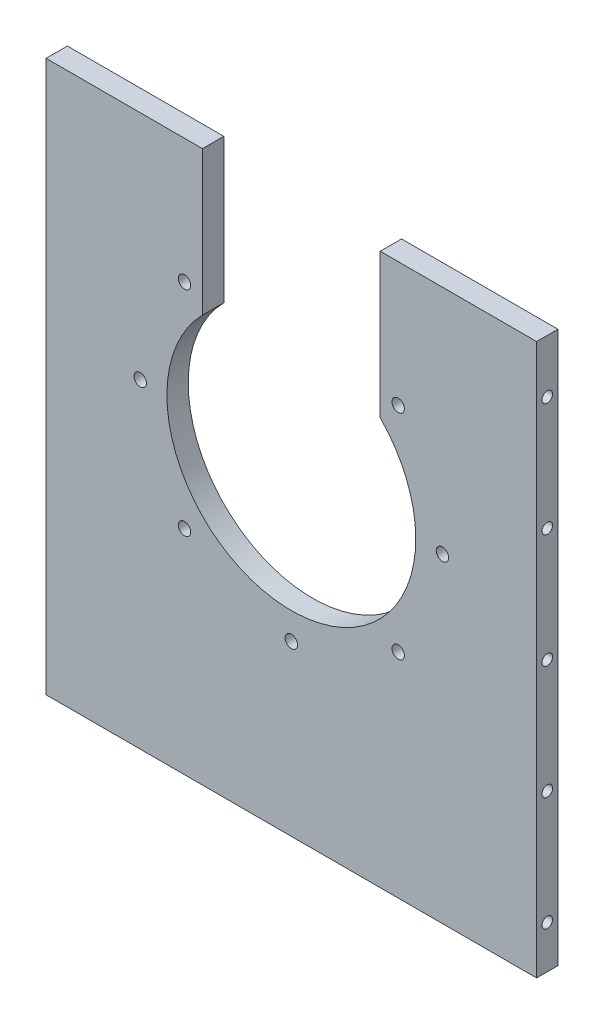
ISO-10303-21;
HEADER;
FILE_DESCRIPTION(('STEP AP214'),'2;1');
FILE_NAME('part.step','',(''),(''),'','','');
FILE_SCHEMA(('AUTOMOTIVE_DESIGN { 1 0 10303 214 1 1 1 1 }'));
ENDSEC;
DATA;
#1=APPLICATION_CONTEXT('core data for automotive mechanical design processes');
#2=APPLICATION_PROTOCOL_DEFINITION('international standard','automotive_design',2000,#1);
#3=PRODUCT_CONTEXT('',#1,'mechanical');
#4=PRODUCT('Part','Part','',(#3));
#5=PRODUCT_RELATED_PRODUCT_CATEGORY('part','',(#4));
#6=PRODUCT_DEFINITION_FORMATION('','',#4);
#7=PRODUCT_DEFINITION_CONTEXT('part definition',#1,'design');
#8=PRODUCT_DEFINITION('design','',#6,#7);
#9=PRODUCT_DEFINITION_SHAPE('','',#8);
#10=(LENGTH_UNIT() NAMED_UNIT(*) SI_UNIT(.MILLI.,.METRE.));
#11=(NAMED_UNIT(*) PLANE_ANGLE_UNIT() SI_UNIT($,.RADIAN.));
#12=(NAMED_UNIT(*) SI_UNIT($,.STERADIAN.) SOLID_ANGLE_UNIT());
#13=UNCERTAINTY_MEASURE_WITH_UNIT(LENGTH_MEASURE(1.E-05),#10,'distance_accuracy_value','');
#14=(GEOMETRIC_REPRESENTATION_CONTEXT(3) GLOBAL_UNCERTAINTY_ASSIGNED_CONTEXT((#13)) GLOBAL_UNIT_ASSIGNED_CONTEXT((#10,
#11,#12)) REPRESENTATION_CONTEXT('',''));
#15=CARTESIAN_POINT('',(0.,0.,0.));
#16=DIRECTION('',(0.,0.,1.));
#17=DIRECTION('',(1.,0.,0.));
#18=AXIS2_PLACEMENT_3D('',#15,#16,#17);
#19=CARTESIAN_POINT('',(0.,0.,6.));
#20=DIRECTION('',(0.,0.,1.));
#21=DIRECTION('',(1.,0.,0.));
#22=AXIS2_PLACEMENT_3D('',#19,#20,#21);
#23=PLANE('',#22);
#24=DIRECTION('',(1.,0.,0.));
#25=VECTOR('',#24,1.);
#26=CARTESIAN_POINT('',(0.,65.0520382004283,6.));
#27=LINE('',#26,#25);
#28=CARTESIAN_POINT('',(-69.,65.0520382004283,6.));
#29=VERTEX_POINT('',#28);
#30=CARTESIAN_POINT('',(-25.,65.0520382004283,6.));
#31=VERTEX_POINT('',#30);
#32=EDGE_CURVE('E62',#29,#31,#27,.T.);
#33=ORIENTED_EDGE('',*,*,#32,.F.);
#34=DIRECTION('',(0.,-1.,0.));
#35=VECTOR('',#34,1.);
#36=CARTESIAN_POINT('',(-69.,90.,6.));
#37=LINE('',#36,#35);
#38=CARTESIAN_POINT('',(-69.,-90.,6.));
#39=VERTEX_POINT('',#38);
#40=EDGE_CURVE('E130',#29,#39,#37,.T.);
#41=ORIENTED_EDGE('',*,*,#40,.T.);
#42=DIRECTION('',(1.,0.,0.));
#43=VECTOR('',#42,1.);
#44=CARTESIAN_POINT('',(-69.,-90.,6.));
#45=LINE('',#44,#43);
#46=CARTESIAN_POINT('',(69.,-90.,6.));
#47=VERTEX_POINT('',#46);
#48=EDGE_CURVE('E135',#39,#47,#45,.T.);
#49=ORIENTED_EDGE('',*,*,#48,.T.);
#50=DIRECTION('',(0.,1.,0.));
#51=VECTOR('',#50,1.);
#52=CARTESIAN_POINT('',(69.,90.,6.));
#53=LINE('',#52,#51);
#54=CARTESIAN_POINT('',(69.,65.0520382004283,6.));
#55=VERTEX_POINT('',#54);
#56=EDGE_CURVE('E144',#47,#55,#53,.T.);
#57=ORIENTED_EDGE('',*,*,#56,.T.);
#58=CARTESIAN_POINT('',(25.,65.0520382004283,6.));
#59=VERTEX_POINT('',#58);
#60=EDGE_CURVE('E105',#59,#55,#27,.T.);
#61=ORIENTED_EDGE('',*,*,#60,.F.);
#62=DIRECTION('',(0.,1.,0.));
#63=VECTOR('',#62,1.);
#64=CARTESIAN_POINT('',(25.,0.,6.));
#65=LINE('',#64,#63);
#66=CARTESIAN_POINT('',(25.,24.4948974278318,6.));
#67=VERTEX_POINT('',#66);
#68=EDGE_CURVE('E157',#67,#59,#65,.T.);
#69=ORIENTED_EDGE('',*,*,#68,.F.);
#70=CARTESIAN_POINT('',(0.,0.,6.));
#71=DIRECTION('',(0.,0.,1.));
#72=DIRECTION('',(1.,0.,0.));
#73=AXIS2_PLACEMENT_3D('',#70,#71,#72);
#74=CIRCLE('',#73,35.);
#75=CARTESIAN_POINT('',(-25.,24.4948974278318,6.));
#76=VERTEX_POINT('',#75);
#77=EDGE_CURVE('E165',#76,#67,#74,.T.);
#78=ORIENTED_EDGE('',*,*,#77,.F.);
#79=DIRECTION('',(0.,1.,0.));
#80=VECTOR('',#79,1.);
#81=CARTESIAN_POINT('',(-25.,0.,6.));
#82=LINE('',#81,#80);
#83=EDGE_CURVE('E168',#76,#31,#82,.T.);
#84=ORIENTED_EDGE('',*,*,#83,.T.);
#85=EDGE_LOOP('',(#33,#41,#49,#57,#61,#69,#78,#84));
#86=FACE_BOUND('',#85,.T.);
#87=CARTESIAN_POINT('',(-42.5,0.,6.));
#88=DIRECTION('',(0.,0.,1.));
#89=DIRECTION('',(1.,0.,0.));
#90=AXIS2_PLACEMENT_3D('',#87,#88,#89);
#91=CIRCLE('',#90,1.75);
#92=CARTESIAN_POINT('',(-40.75,0.,6.));
#93=VERTEX_POINT('',#92);
#94=EDGE_CURVE('E219',#93,#93,#91,.T.);
#95=ORIENTED_EDGE('',*,*,#94,.F.);
#96=EDGE_LOOP('',(#95));
#97=FACE_BOUND('',#96,.T.);
#98=CARTESIAN_POINT('',(0.,-42.5,6.));
#99=DIRECTION('',(0.,0.,1.));
#100=DIRECTION('',(1.,0.,0.));
#101=AXIS2_PLACEMENT_3D('',#98,#99,#100);
#102=CIRCLE('',#101,1.75);
#103=CARTESIAN_POINT('',(1.74999999999999,-42.5,6.));
#104=VERTEX_POINT('',#103);
#105=EDGE_CURVE('E235',#104,#104,#102,.T.);
#106=ORIENTED_EDGE('',*,*,#105,.F.);
#107=EDGE_LOOP('',(#106));
#108=FACE_BOUND('',#107,.T.);
#109=CARTESIAN_POINT('',(42.5,0.,6.));
#110=DIRECTION('',(0.,0.,1.));
#111=DIRECTION('',(1.,0.,0.));
#112=AXIS2_PLACEMENT_3D('',#109,#110,#111);
#113=CIRCLE('',#112,1.75);
#114=CARTESIAN_POINT('',(44.25,0.,6.));
#115=VERTEX_POINT('',#114);
#116=EDGE_CURVE('E251',#115,#115,#113,.T.);
#117=ORIENTED_EDGE('',*,*,#116,.F.);
#118=EDGE_LOOP('',(#117));
#119=FACE_BOUND('',#118,.T.);
#120=CARTESIAN_POINT('',(30.0520382004283,30.0520382004283,6.));
#121=DIRECTION('',(0.,0.,1.));
#122=DIRECTION('',(1.,0.,0.));
#123=AXIS2_PLACEMENT_3D('',#120,#121,#122);
#124=CIRCLE('',#123,1.75);
#125=CARTESIAN_POINT('',(31.8020382004283,30.0520382004283,6.));
#126=VERTEX_POINT('',#125);
#127=EDGE_CURVE('E177',#126,#126,#124,.T.);
#128=ORIENTED_EDGE('',*,*,#127,.F.);
#129=EDGE_LOOP('',(#128));
#130=FACE_BOUND('',#129,.T.);
#131=CARTESIAN_POINT('',(30.0520382004283,-30.0520382004283,6.));
#132=DIRECTION('',(0.,0.,1.));
#133=DIRECTION('',(1.,0.,0.));
#134=AXIS2_PLACEMENT_3D('',#131,#132,#133);
#135=CIRCLE('',#134,1.75);
#136=CARTESIAN_POINT('',(31.8020382004283,-30.0520382004283,6.));
#137=VERTEX_POINT('',#136);
#138=EDGE_CURVE('E243',#137,#137,#135,.T.);
#139=ORIENTED_EDGE('',*,*,#138,.F.);
#140=EDGE_LOOP('',(#139));
#141=FACE_BOUND('',#140,.T.);
#142=CARTESIAN_POINT('',(-30.0520382004283,-30.0520382004283,6.));
#143=DIRECTION('',(0.,0.,1.));
#144=DIRECTION('',(1.,0.,0.));
#145=AXIS2_PLACEMENT_3D('',#142,#143,#144);
#146=CIRCLE('',#145,1.75);
#147=CARTESIAN_POINT('',(-28.3020382004283,-30.0520382004283,6.));
#148=VERTEX_POINT('',#147);
#149=EDGE_CURVE('E227',#148,#148,#146,.T.);
#150=ORIENTED_EDGE('',*,*,#149,.F.);
#151=EDGE_LOOP('',(#150));
#152=FACE_BOUND('',#151,.T.);
#153=CARTESIAN_POINT('',(-30.0520382004283,30.0520382004283,6.));
#154=DIRECTION('',(0.,0.,1.));
#155=DIRECTION('',(1.,0.,0.));
#156=AXIS2_PLACEMENT_3D('',#153,#154,#155);
#157=CIRCLE('',#156,1.75);
#158=CARTESIAN_POINT('',(-28.3020382004283,30.0520382004283,6.));
#159=VERTEX_POINT('',#158);
#160=EDGE_CURVE('E211',#159,#159,#157,.T.);
#161=ORIENTED_EDGE('',*,*,#160,.F.);
#162=EDGE_LOOP('',(#161));
#163=FACE_BOUND('',#162,.T.);
#164=ADVANCED_FACE('F39',(#86,#97,#108,#119,#130,#141,#152,#163),#23,.T.);
#165=CARTESIAN_POINT('',(0.,0.,0.));
#166=DIRECTION('',(0.,0.,1.));
#167=DIRECTION('',(1.,0.,0.));
#168=AXIS2_PLACEMENT_3D('',#165,#166,#167);
#169=PLANE('',#168);
#170=DIRECTION('',(0.,-1.,0.));
#171=VECTOR('',#170,1.);
#172=CARTESIAN_POINT('',(-69.,90.,0.));
#173=LINE('',#172,#171);
#174=CARTESIAN_POINT('',(-69.,65.0520382004283,0.));
#175=VERTEX_POINT('',#174);
#176=CARTESIAN_POINT('',(-69.,-90.,0.));
#177=VERTEX_POINT('',#176);
#178=EDGE_CURVE('E137',#175,#177,#173,.T.);
#179=ORIENTED_EDGE('',*,*,#178,.F.);
#180=DIRECTION('',(-1.,0.,0.));
#181=VECTOR('',#180,1.);
#182=CARTESIAN_POINT('',(87.3385442170968,65.0520382004283,0.));
#183=LINE('',#182,#181);
#184=CARTESIAN_POINT('',(-25.,65.0520382004283,0.));
#185=VERTEX_POINT('',#184);
#186=EDGE_CURVE('E123',#185,#175,#183,.T.);
#187=ORIENTED_EDGE('',*,*,#186,.F.);
#188=DIRECTION('',(0.,-1.,0.));
#189=VECTOR('',#188,1.);
#190=CARTESIAN_POINT('',(-25.,70.,0.));
#191=LINE('',#190,#189);
#192=CARTESIAN_POINT('',(-25.,24.4948974278318,0.));
#193=VERTEX_POINT('',#192);
#194=EDGE_CURVE('E206',#185,#193,#191,.T.);
#195=ORIENTED_EDGE('',*,*,#194,.T.);
#196=CARTESIAN_POINT('',(0.,0.,0.));
#197=DIRECTION('',(0.,0.,1.));
#198=DIRECTION('',(1.,0.,0.));
#199=AXIS2_PLACEMENT_3D('',#196,#197,#198);
#200=CIRCLE('',#199,35.);
#201=CARTESIAN_POINT('',(25.,24.4948974278318,0.));
#202=VERTEX_POINT('',#201);
#203=EDGE_CURVE('E173',#193,#202,#200,.T.);
#204=ORIENTED_EDGE('',*,*,#203,.T.);
#205=DIRECTION('',(0.,-1.,0.));
#206=VECTOR('',#205,1.);
#207=CARTESIAN_POINT('',(25.,70.,0.));
#208=LINE('',#207,#206);
#209=CARTESIAN_POINT('',(25.,65.0520382004283,0.));
#210=VERTEX_POINT('',#209);
#211=EDGE_CURVE('E111',#210,#202,#208,.T.);
#212=ORIENTED_EDGE('',*,*,#211,.F.);
#213=CARTESIAN_POINT('',(69.,65.0520382004283,0.));
#214=VERTEX_POINT('',#213);
#215=EDGE_CURVE('E55',#214,#210,#183,.T.);
#216=ORIENTED_EDGE('',*,*,#215,.F.);
#217=DIRECTION('',(0.,1.,0.));
#218=VECTOR('',#217,1.);
#219=CARTESIAN_POINT('',(69.,90.,0.));
#220=LINE('',#219,#218);
#221=CARTESIAN_POINT('',(69.,-90.,0.));
#222=VERTEX_POINT('',#221);
#223=EDGE_CURVE('E120',#222,#214,#220,.T.);
#224=ORIENTED_EDGE('',*,*,#223,.F.);
#225=DIRECTION('',(1.,0.,0.));
#226=VECTOR('',#225,1.);
#227=CARTESIAN_POINT('',(-69.,-90.,0.));
#228=LINE('',#227,#226);
#229=EDGE_CURVE('E131',#177,#222,#228,.T.);
#230=ORIENTED_EDGE('',*,*,#229,.F.);
#231=EDGE_LOOP('',(#179,#187,#195,#204,#212,#216,#224,#230));
#232=FACE_BOUND('',#231,.T.);
#233=CARTESIAN_POINT('',(30.0520382004283,30.0520382004283,0.));
#234=DIRECTION('',(0.,0.,1.));
#235=DIRECTION('',(1.,0.,0.));
#236=AXIS2_PLACEMENT_3D('',#233,#234,#235);
#237=CIRCLE('',#236,1.75);
#238=CARTESIAN_POINT('',(31.8020382004283,30.0520382004283,0.));
#239=VERTEX_POINT('',#238);
#240=EDGE_CURVE('E180',#239,#239,#237,.T.);
#241=ORIENTED_EDGE('',*,*,#240,.T.);
#242=EDGE_LOOP('',(#241));
#243=FACE_BOUND('',#242,.T.);
#244=CARTESIAN_POINT('',(42.5,0.,0.));
#245=DIRECTION('',(0.,0.,1.));
#246=DIRECTION('',(1.,0.,0.));
#247=AXIS2_PLACEMENT_3D('',#244,#245,#246);
#248=CIRCLE('',#247,1.75);
#249=CARTESIAN_POINT('',(44.25,0.,0.));
#250=VERTEX_POINT('',#249);
#251=EDGE_CURVE('E247',#250,#250,#248,.T.);
#252=ORIENTED_EDGE('',*,*,#251,.T.);
#253=EDGE_LOOP('',(#252));
#254=FACE_BOUND('',#253,.T.);
#255=CARTESIAN_POINT('',(30.0520382004283,-30.0520382004283,0.));
#256=DIRECTION('',(0.,0.,1.));
#257=DIRECTION('',(1.,0.,0.));
#258=AXIS2_PLACEMENT_3D('',#255,#256,#257);
#259=CIRCLE('',#258,1.75);
#260=CARTESIAN_POINT('',(31.8020382004283,-30.0520382004283,0.));
#261=VERTEX_POINT('',#260);
#262=EDGE_CURVE('E239',#261,#261,#259,.T.);
#263=ORIENTED_EDGE('',*,*,#262,.T.);
#264=EDGE_LOOP('',(#263));
#265=FACE_BOUND('',#264,.T.);
#266=CARTESIAN_POINT('',(0.,-42.5,0.));
#267=DIRECTION('',(0.,0.,1.));
#268=DIRECTION('',(1.,0.,0.));
#269=AXIS2_PLACEMENT_3D('',#266,#267,#268);
#270=CIRCLE('',#269,1.75);
#271=CARTESIAN_POINT('',(1.74999999999999,-42.5,0.));
#272=VERTEX_POINT('',#271);
#273=EDGE_CURVE('E231',#272,#272,#270,.T.);
#274=ORIENTED_EDGE('',*,*,#273,.T.);
#275=EDGE_LOOP('',(#274));
#276=FACE_BOUND('',#275,.T.);
#277=CARTESIAN_POINT('',(-30.0520382004283,-30.0520382004283,0.));
#278=DIRECTION('',(0.,0.,1.));
#279=DIRECTION('',(1.,0.,0.));
#280=AXIS2_PLACEMENT_3D('',#277,#278,#279);
#281=CIRCLE('',#280,1.75);
#282=CARTESIAN_POINT('',(-28.3020382004283,-30.0520382004283,0.));
#283=VERTEX_POINT('',#282);
#284=EDGE_CURVE('E223',#283,#283,#281,.T.);
#285=ORIENTED_EDGE('',*,*,#284,.T.);
#286=EDGE_LOOP('',(#285));
#287=FACE_BOUND('',#286,.T.);
#288=CARTESIAN_POINT('',(-42.5,0.,0.));
#289=DIRECTION('',(0.,0.,1.));
#290=DIRECTION('',(1.,0.,0.));
#291=AXIS2_PLACEMENT_3D('',#288,#289,#290);
#292=CIRCLE('',#291,1.75);
#293=CARTESIAN_POINT('',(-40.75,0.,0.));
#294=VERTEX_POINT('',#293);
#295=EDGE_CURVE('E215',#294,#294,#292,.T.);
#296=ORIENTED_EDGE('',*,*,#295,.T.);
#297=EDGE_LOOP('',(#296));
#298=FACE_BOUND('',#297,.T.);
#299=CARTESIAN_POINT('',(-30.0520382004283,30.0520382004283,0.));
#300=DIRECTION('',(0.,0.,1.));
#301=DIRECTION('',(1.,0.,0.));
#302=AXIS2_PLACEMENT_3D('',#299,#300,#301);
#303=CIRCLE('',#302,1.75);
#304=CARTESIAN_POINT('',(-28.3020382004283,30.0520382004283,0.));
#305=VERTEX_POINT('',#304);
#306=EDGE_CURVE('E167',#305,#305,#303,.T.);
#307=ORIENTED_EDGE('',*,*,#306,.T.);
#308=EDGE_LOOP('',(#307));
#309=FACE_BOUND('',#308,.T.);
#310=ADVANCED_FACE('F117',(#232,#243,#254,#265,#276,#287,#298,#309),#169,.F.);
#311=CARTESIAN_POINT('',(-69.,90.,6.));
#312=DIRECTION('',(1.,0.,0.));
#313=DIRECTION('',(0.,1.,0.));
#314=AXIS2_PLACEMENT_3D('',#311,#312,#313);
#315=PLANE('',#314);
#316=CARTESIAN_POINT('',(-69.,50.0520382004283,3.));
#317=DIRECTION('',(-1.,0.,0.));
#318=DIRECTION('',(0.,-1.,0.));
#319=AXIS2_PLACEMENT_3D('',#316,#317,#318);
#320=CIRCLE('',#319,1.5);
#321=CARTESIAN_POINT('',(-69.,48.5520382004283,3.));
#322=VERTEX_POINT('',#321);
#323=EDGE_CURVE('E297',#322,#322,#320,.T.);
#324=ORIENTED_EDGE('',*,*,#323,.F.);
#325=EDGE_LOOP('',(#324));
#326=FACE_BOUND('',#325,.T.);
#327=CARTESIAN_POINT('',(-69.,18.0520382004283,3.00000000000033));
#328=DIRECTION('',(-1.,0.,0.));
#329=DIRECTION('',(0.,-1.,0.));
#330=AXIS2_PLACEMENT_3D('',#327,#328,#329);
#331=CIRCLE('',#330,1.5);
#332=CARTESIAN_POINT('',(-69.,16.5520382004283,3.00000000000033));
#333=VERTEX_POINT('',#332);
#334=EDGE_CURVE('E301',#333,#333,#331,.T.);
#335=ORIENTED_EDGE('',*,*,#334,.F.);
#336=EDGE_LOOP('',(#335));
#337=FACE_BOUND('',#336,.T.);
#338=CARTESIAN_POINT('',(-69.,-13.9479617995717,3.00000000000067));
#339=DIRECTION('',(-1.,0.,0.));
#340=DIRECTION('',(0.,-1.,0.));
#341=AXIS2_PLACEMENT_3D('',#338,#339,#340);
#342=CIRCLE('',#341,1.5);
#343=CARTESIAN_POINT('',(-69.,-15.4479617995717,3.00000000000067));
#344=VERTEX_POINT('',#343);
#345=EDGE_CURVE('E305',#344,#344,#342,.T.);
#346=ORIENTED_EDGE('',*,*,#345,.F.);
#347=EDGE_LOOP('',(#346));
#348=FACE_BOUND('',#347,.T.);
#349=CARTESIAN_POINT('',(-69.,-45.9479617995717,3.000000000001));
#350=DIRECTION('',(-1.,0.,0.));
#351=DIRECTION('',(0.,-1.,0.));
#352=AXIS2_PLACEMENT_3D('',#349,#350,#351);
#353=CIRCLE('',#352,1.5);
#354=CARTESIAN_POINT('',(-69.,-47.4479617995717,3.000000000001));
#355=VERTEX_POINT('',#354);
#356=EDGE_CURVE('E309',#355,#355,#353,.T.);
#357=ORIENTED_EDGE('',*,*,#356,.F.);
#358=EDGE_LOOP('',(#357));
#359=FACE_BOUND('',#358,.T.);
#360=CARTESIAN_POINT('',(-69.,-77.9479617995717,3.00000000000133));
#361=DIRECTION('',(-1.,0.,0.));
#362=DIRECTION('',(0.,-1.,0.));
#363=AXIS2_PLACEMENT_3D('',#360,#361,#362);
#364=CIRCLE('',#363,1.5);
#365=CARTESIAN_POINT('',(-69.,-79.4479617995717,3.00000000000133));
#366=VERTEX_POINT('',#365);
#367=EDGE_CURVE('E312',#366,#366,#364,.T.);
#368=ORIENTED_EDGE('',*,*,#367,.F.);
#369=EDGE_LOOP('',(#368));
#370=FACE_BOUND('',#369,.T.);
#371=ORIENTED_EDGE('',*,*,#40,.F.);
#372=DIRECTION('',(0.,0.,-1.));
#373=VECTOR('',#372,1.);
#374=CARTESIAN_POINT('',(-69.,65.0520382004283,6.));
#375=LINE('',#374,#373);
#376=EDGE_CURVE('E195',#29,#175,#375,.T.);
#377=ORIENTED_EDGE('',*,*,#376,.T.);
#378=ORIENTED_EDGE('',*,*,#178,.T.);
#379=DIRECTION('',(0.,0.,-1.));
#380=VECTOR('',#379,1.);
#381=CARTESIAN_POINT('',(-69.,-90.,6.));
#382=LINE('',#381,#380);
#383=EDGE_CURVE('E143',#39,#177,#382,.T.);
#384=ORIENTED_EDGE('',*,*,#383,.F.);
#385=EDGE_LOOP('',(#371,#377,#378,#384));
#386=FACE_BOUND('',#385,.T.);
#387=ADVANCED_FACE('F41',(#326,#337,#348,#359,#370,#386),#315,.F.);
#388=CARTESIAN_POINT('',(-69.,-90.,6.));
#389=DIRECTION('',(0.,1.,0.));
#390=DIRECTION('',(-1.,0.,0.));
#391=AXIS2_PLACEMENT_3D('',#388,#389,#390);
#392=PLANE('',#391);
#393=ORIENTED_EDGE('',*,*,#229,.T.);
#394=DIRECTION('',(0.,0.,-1.));
#395=VECTOR('',#394,1.);
#396=CARTESIAN_POINT('',(69.,-90.,6.));
#397=LINE('',#396,#395);
#398=EDGE_CURVE('E128',#47,#222,#397,.T.);
#399=ORIENTED_EDGE('',*,*,#398,.F.);
#400=ORIENTED_EDGE('',*,*,#48,.F.);
#401=ORIENTED_EDGE('',*,*,#383,.T.);
#402=EDGE_LOOP('',(#393,#399,#400,#401));
#403=FACE_BOUND('',#402,.T.);
#404=ADVANCED_FACE('F190',(#403),#392,.F.);
#405=CARTESIAN_POINT('',(69.,90.,6.));
#406=DIRECTION('',(-1.,0.,0.));
#407=DIRECTION('',(0.,-1.,0.));
#408=AXIS2_PLACEMENT_3D('',#405,#406,#407);
#409=PLANE('',#408);
#410=CARTESIAN_POINT('',(69.,50.0520382004283,3.));
#411=DIRECTION('',(-1.,0.,0.));
#412=DIRECTION('',(0.,-1.,0.));
#413=AXIS2_PLACEMENT_3D('',#410,#411,#412);
#414=CIRCLE('',#413,1.5);
#415=CARTESIAN_POINT('',(69.,48.5520382004283,3.));
#416=VERTEX_POINT('',#415);
#417=EDGE_CURVE('E651',#416,#416,#414,.T.);
#418=ORIENTED_EDGE('',*,*,#417,.T.);
#419=EDGE_LOOP('',(#418));
#420=FACE_BOUND('',#419,.T.);
#421=CARTESIAN_POINT('',(69.,18.0520382004283,3.00000000000033));
#422=DIRECTION('',(-1.,0.,0.));
#423=DIRECTION('',(0.,-1.,0.));
#424=AXIS2_PLACEMENT_3D('',#421,#422,#423);
#425=CIRCLE('',#424,1.5);
#426=CARTESIAN_POINT('',(69.,16.5520382004283,3.00000000000033));
#427=VERTEX_POINT('',#426);
#428=EDGE_CURVE('E661',#427,#427,#425,.T.);
#429=ORIENTED_EDGE('',*,*,#428,.T.);
#430=EDGE_LOOP('',(#429));
#431=FACE_BOUND('',#430,.T.);
#432=CARTESIAN_POINT('',(69.,-13.9479617995717,3.00000000000067));
#433=DIRECTION('',(-1.,0.,0.));
#434=DIRECTION('',(0.,-1.,0.));
#435=AXIS2_PLACEMENT_3D('',#432,#433,#434);
#436=CIRCLE('',#435,1.5);
#437=CARTESIAN_POINT('',(69.,-15.4479617995717,3.00000000000067));
#438=VERTEX_POINT('',#437);
#439=EDGE_CURVE('E669',#438,#438,#436,.T.);
#440=ORIENTED_EDGE('',*,*,#439,.T.);
#441=EDGE_LOOP('',(#440));
#442=FACE_BOUND('',#441,.T.);
#443=CARTESIAN_POINT('',(69.,-45.9479617995717,3.000000000001));
#444=DIRECTION('',(-1.,0.,0.));
#445=DIRECTION('',(0.,-1.,0.));
#446=AXIS2_PLACEMENT_3D('',#443,#444,#445);
#447=CIRCLE('',#446,1.5);
#448=CARTESIAN_POINT('',(69.,-47.4479617995717,3.000000000001));
#449=VERTEX_POINT('',#448);
#450=EDGE_CURVE('E677',#449,#449,#447,.T.);
#451=ORIENTED_EDGE('',*,*,#450,.T.);
#452=EDGE_LOOP('',(#451));
#453=FACE_BOUND('',#452,.T.);
#454=CARTESIAN_POINT('',(69.,-77.9479617995717,3.00000000000133));
#455=DIRECTION('',(-1.,0.,0.));
#456=DIRECTION('',(0.,-1.,0.));
#457=AXIS2_PLACEMENT_3D('',#454,#455,#456);
#458=CIRCLE('',#457,1.5);
#459=CARTESIAN_POINT('',(69.,-79.4479617995717,3.00000000000133));
#460=VERTEX_POINT('',#459);
#461=EDGE_CURVE('E336',#460,#460,#458,.T.);
#462=ORIENTED_EDGE('',*,*,#461,.T.);
#463=EDGE_LOOP('',(#462));
#464=FACE_BOUND('',#463,.T.);
#465=ORIENTED_EDGE('',*,*,#223,.T.);
#466=DIRECTION('',(0.,0.,1.));
#467=VECTOR('',#466,1.);
#468=CARTESIAN_POINT('',(69.,65.0520382004283,6.));
#469=LINE('',#468,#467);
#470=EDGE_CURVE('E102',#214,#55,#469,.T.);
#471=ORIENTED_EDGE('',*,*,#470,.T.);
#472=ORIENTED_EDGE('',*,*,#56,.F.);
#473=ORIENTED_EDGE('',*,*,#398,.T.);
#474=EDGE_LOOP('',(#465,#471,#472,#473));
#475=FACE_BOUND('',#474,.T.);
#476=ADVANCED_FACE('F126',(#420,#431,#442,#453,#464,#475),#409,.F.);
#477=CARTESIAN_POINT('',(0.,0.,6.));
#478=DIRECTION('',(0.,0.,-1.));
#479=DIRECTION('',(-1.,0.,0.));
#480=AXIS2_PLACEMENT_3D('',#477,#478,#479);
#481=CYLINDRICAL_SURFACE('',#480,35.);
#482=DIRECTION('',(0.,0.,-1.));
#483=VECTOR('',#482,1.);
#484=CARTESIAN_POINT('',(25.,24.4948974278318,6.));
#485=LINE('',#484,#483);
#486=EDGE_CURVE('E48',#202,#67,#485,.F.);
#487=ORIENTED_EDGE('',*,*,#486,.F.);
#488=ORIENTED_EDGE('',*,*,#203,.F.);
#489=DIRECTION('',(0.,0.,-1.));
#490=VECTOR('',#489,1.);
#491=CARTESIAN_POINT('',(-25.,24.4948974278318,6.));
#492=LINE('',#491,#490);
#493=EDGE_CURVE('E148',#193,#76,#492,.F.);
#494=ORIENTED_EDGE('',*,*,#493,.T.);
#495=ORIENTED_EDGE('',*,*,#77,.T.);
#496=EDGE_LOOP('',(#487,#488,#494,#495));
#497=FACE_BOUND('',#496,.T.);
#498=ADVANCED_FACE('F170',(#497),#481,.F.);
#499=CARTESIAN_POINT('',(30.0520382004283,30.0520382004283,6.));
#500=DIRECTION('',(0.,0.,-1.));
#501=DIRECTION('',(-1.,0.,0.));
#502=AXIS2_PLACEMENT_3D('',#499,#500,#501);
#503=CYLINDRICAL_SURFACE('',#502,1.75);
#504=ORIENTED_EDGE('',*,*,#127,.T.);
#505=EDGE_LOOP('',(#504));
#506=FACE_BOUND('',#505,.T.);
#507=ORIENTED_EDGE('',*,*,#240,.F.);
#508=EDGE_LOOP('',(#507));
#509=FACE_BOUND('',#508,.T.);
#510=ADVANCED_FACE('F266',(#506,#509),#503,.F.);
#511=CARTESIAN_POINT('',(42.5,0.,6.));
#512=DIRECTION('',(0.,0.,-1.));
#513=DIRECTION('',(-1.,0.,0.));
#514=AXIS2_PLACEMENT_3D('',#511,#512,#513);
#515=CYLINDRICAL_SURFACE('',#514,1.75);
#516=ORIENTED_EDGE('',*,*,#116,.T.);
#517=EDGE_LOOP('',(#516));
#518=FACE_BOUND('',#517,.T.);
#519=ORIENTED_EDGE('',*,*,#251,.F.);
#520=EDGE_LOOP('',(#519));
#521=FACE_BOUND('',#520,.T.);
#522=ADVANCED_FACE('F268',(#518,#521),#515,.F.);
#523=CARTESIAN_POINT('',(30.0520382004283,-30.0520382004283,6.));
#524=DIRECTION('',(0.,0.,-1.));
#525=DIRECTION('',(-1.,0.,0.));
#526=AXIS2_PLACEMENT_3D('',#523,#524,#525);
#527=CYLINDRICAL_SURFACE('',#526,1.75);
#528=ORIENTED_EDGE('',*,*,#138,.T.);
#529=EDGE_LOOP('',(#528));
#530=FACE_BOUND('',#529,.T.);
#531=ORIENTED_EDGE('',*,*,#262,.F.);
#532=EDGE_LOOP('',(#531));
#533=FACE_BOUND('',#532,.T.);
#534=ADVANCED_FACE('F274',(#530,#533),#527,.F.);
#535=CARTESIAN_POINT('',(0.,-42.5,6.));
#536=DIRECTION('',(0.,0.,-1.));
#537=DIRECTION('',(-1.,0.,0.));
#538=AXIS2_PLACEMENT_3D('',#535,#536,#537);
#539=CYLINDRICAL_SURFACE('',#538,1.75);
#540=ORIENTED_EDGE('',*,*,#105,.T.);
#541=EDGE_LOOP('',(#540));
#542=FACE_BOUND('',#541,.T.);
#543=ORIENTED_EDGE('',*,*,#273,.F.);
#544=EDGE_LOOP('',(#543));
#545=FACE_BOUND('',#544,.T.);
#546=ADVANCED_FACE('F396',(#542,#545),#539,.F.);
#547=CARTESIAN_POINT('',(-30.0520382004283,-30.0520382004283,6.));
#548=DIRECTION('',(0.,0.,-1.));
#549=DIRECTION('',(-1.,0.,0.));
#550=AXIS2_PLACEMENT_3D('',#547,#548,#549);
#551=CYLINDRICAL_SURFACE('',#550,1.75);
#552=ORIENTED_EDGE('',*,*,#149,.T.);
#553=EDGE_LOOP('',(#552));
#554=FACE_BOUND('',#553,.T.);
#555=ORIENTED_EDGE('',*,*,#284,.F.);
#556=EDGE_LOOP('',(#555));
#557=FACE_BOUND('',#556,.T.);
#558=ADVANCED_FACE('F392',(#554,#557),#551,.F.);
#559=CARTESIAN_POINT('',(-42.5,0.,6.));
#560=DIRECTION('',(0.,0.,-1.));
#561=DIRECTION('',(-1.,0.,0.));
#562=AXIS2_PLACEMENT_3D('',#559,#560,#561);
#563=CYLINDRICAL_SURFACE('',#562,1.75);
#564=ORIENTED_EDGE('',*,*,#94,.T.);
#565=EDGE_LOOP('',(#564));
#566=FACE_BOUND('',#565,.T.);
#567=ORIENTED_EDGE('',*,*,#295,.F.);
#568=EDGE_LOOP('',(#567));
#569=FACE_BOUND('',#568,.T.);
#570=ADVANCED_FACE('F388',(#566,#569),#563,.F.);
#571=CARTESIAN_POINT('',(-30.0520382004283,30.0520382004283,6.));
#572=DIRECTION('',(0.,0.,-1.));
#573=DIRECTION('',(-1.,0.,0.));
#574=AXIS2_PLACEMENT_3D('',#571,#572,#573);
#575=CYLINDRICAL_SURFACE('',#574,1.75);
#576=ORIENTED_EDGE('',*,*,#160,.T.);
#577=EDGE_LOOP('',(#576));
#578=FACE_BOUND('',#577,.T.);
#579=ORIENTED_EDGE('',*,*,#306,.F.);
#580=EDGE_LOOP('',(#579));
#581=FACE_BOUND('',#580,.T.);
#582=ADVANCED_FACE('F385',(#578,#581),#575,.F.);
#583=CARTESIAN_POINT('',(25.,70.,10.));
#584=DIRECTION('',(1.,0.,0.));
#585=DIRECTION('',(0.,1.,0.));
#586=AXIS2_PLACEMENT_3D('',#583,#584,#585);
#587=PLANE('',#586);
#588=ORIENTED_EDGE('',*,*,#68,.T.);
#589=DIRECTION('',(0.,0.,-1.));
#590=VECTOR('',#589,1.);
#591=CARTESIAN_POINT('',(25.,65.0520382004283,10.));
#592=LINE('',#591,#590);
#593=EDGE_CURVE('E197',#59,#210,#592,.T.);
#594=ORIENTED_EDGE('',*,*,#593,.T.);
#595=ORIENTED_EDGE('',*,*,#211,.T.);
#596=ORIENTED_EDGE('',*,*,#486,.T.);
#597=EDGE_LOOP('',(#588,#594,#595,#596));
#598=FACE_BOUND('',#597,.T.);
#599=ADVANCED_FACE('F156',(#598),#587,.F.);
#600=CARTESIAN_POINT('',(-25.,70.,10.));
#601=DIRECTION('',(1.,0.,0.));
#602=DIRECTION('',(0.,1.,0.));
#603=AXIS2_PLACEMENT_3D('',#600,#601,#602);
#604=PLANE('',#603);
#605=DIRECTION('',(0.,0.,-1.));
#606=VECTOR('',#605,1.);
#607=CARTESIAN_POINT('',(-25.,65.0520382004283,10.));
#608=LINE('',#607,#606);
#609=EDGE_CURVE('E11',#31,#185,#608,.T.);
#610=ORIENTED_EDGE('',*,*,#609,.F.);
#611=ORIENTED_EDGE('',*,*,#83,.F.);
#612=ORIENTED_EDGE('',*,*,#493,.F.);
#613=ORIENTED_EDGE('',*,*,#194,.F.);
#614=EDGE_LOOP('',(#610,#611,#612,#613));
#615=FACE_BOUND('',#614,.T.);
#616=ADVANCED_FACE('F379',(#615),#604,.T.);
#617=CARTESIAN_POINT('',(87.3385442170968,65.0520382004283,10.));
#618=DIRECTION('',(0.,-1.,0.));
#619=DIRECTION('',(0.,0.,-1.));
#620=AXIS2_PLACEMENT_3D('',#617,#618,#619);
#621=PLANE('',#620);
#622=ORIENTED_EDGE('',*,*,#32,.T.);
#623=ORIENTED_EDGE('',*,*,#609,.T.);
#624=ORIENTED_EDGE('',*,*,#186,.T.);
#625=ORIENTED_EDGE('',*,*,#376,.F.);
#626=EDGE_LOOP('',(#622,#623,#624,#625));
#627=FACE_BOUND('',#626,.T.);
#628=ADVANCED_FACE('F378',(#627),#621,.F.);
#629=ORIENTED_EDGE('',*,*,#215,.T.);
#630=ORIENTED_EDGE('',*,*,#593,.F.);
#631=ORIENTED_EDGE('',*,*,#60,.T.);
#632=ORIENTED_EDGE('',*,*,#470,.F.);
#633=EDGE_LOOP('',(#629,#630,#631,#632));
#634=FACE_BOUND('',#633,.T.);
#635=ADVANCED_FACE('F103',(#634),#621,.F.);
#636=CARTESIAN_POINT('',(-54.,-77.9479617995717,3.00000000000133));
#637=DIRECTION('',(-1.,0.,0.));
#638=DIRECTION('',(0.,-1.,0.));
#639=AXIS2_PLACEMENT_3D('',#636,#637,#638);
#640=CYLINDRICAL_SURFACE('',#639,1.5);
#641=CARTESIAN_POINT('',(-54.,-77.9479617995717,3.00000000000133));
#642=DIRECTION('',(-1.,0.,0.));
#643=DIRECTION('',(0.,-1.,0.));
#644=AXIS2_PLACEMENT_3D('',#641,#642,#643);
#645=CIRCLE('',#644,1.5);
#646=CARTESIAN_POINT('',(-54.,-79.4479617995717,3.00000000000133));
#647=VERTEX_POINT('',#646);
#648=EDGE_CURVE('E316',#647,#647,#645,.T.);
#649=ORIENTED_EDGE('',*,*,#648,.F.);
#650=EDGE_LOOP('',(#649));
#651=FACE_BOUND('',#650,.T.);
#652=ORIENTED_EDGE('',*,*,#367,.T.);
#653=EDGE_LOOP('',(#652));
#654=FACE_BOUND('',#653,.T.);
#655=ADVANCED_FACE('F365',(#651,#654),#640,.F.);
#656=CARTESIAN_POINT('',(-54.,-77.9479617995717,3.00000000000133));
#657=DIRECTION('',(-1.,0.,0.));
#658=DIRECTION('',(0.,-1.,0.));
#659=AXIS2_PLACEMENT_3D('',#656,#657,#658);
#660=PLANE('',#659);
#661=ORIENTED_EDGE('',*,*,#648,.T.);
#662=EDGE_LOOP('',(#661));
#663=FACE_BOUND('',#662,.T.);
#664=ADVANCED_FACE('F355',(#663),#660,.T.);
#665=CARTESIAN_POINT('',(-54.,-45.9479617995717,3.000000000001));
#666=DIRECTION('',(-1.,0.,0.));
#667=DIRECTION('',(0.,-1.,0.));
#668=AXIS2_PLACEMENT_3D('',#665,#666,#667);
#669=CYLINDRICAL_SURFACE('',#668,1.5);
#670=CARTESIAN_POINT('',(-54.,-45.9479617995717,3.000000000001));
#671=DIRECTION('',(-1.,0.,0.));
#672=DIRECTION('',(0.,-1.,0.));
#673=AXIS2_PLACEMENT_3D('',#670,#671,#672);
#674=CIRCLE('',#673,1.5);
#675=CARTESIAN_POINT('',(-54.,-47.4479617995717,3.000000000001));
#676=VERTEX_POINT('',#675);
#677=EDGE_CURVE('E315',#676,#676,#674,.T.);
#678=ORIENTED_EDGE('',*,*,#677,.F.);
#679=EDGE_LOOP('',(#678));
#680=FACE_BOUND('',#679,.T.);
#681=ORIENTED_EDGE('',*,*,#356,.T.);
#682=EDGE_LOOP('',(#681));
#683=FACE_BOUND('',#682,.T.);
#684=ADVANCED_FACE('F352',(#680,#683),#669,.F.);
#685=CARTESIAN_POINT('',(-54.,-45.9479617995717,3.000000000001));
#686=DIRECTION('',(-1.,0.,0.));
#687=DIRECTION('',(0.,-1.,0.));
#688=AXIS2_PLACEMENT_3D('',#685,#686,#687);
#689=PLANE('',#688);
#690=ORIENTED_EDGE('',*,*,#677,.T.);
#691=EDGE_LOOP('',(#690));
#692=FACE_BOUND('',#691,.T.);
#693=ADVANCED_FACE('F354',(#692),#689,.T.);
#694=CARTESIAN_POINT('',(-54.,-13.9479617995717,3.00000000000067));
#695=DIRECTION('',(-1.,0.,0.));
#696=DIRECTION('',(0.,-1.,0.));
#697=AXIS2_PLACEMENT_3D('',#694,#695,#696);
#698=CYLINDRICAL_SURFACE('',#697,1.5);
#699=CARTESIAN_POINT('',(-54.,-13.9479617995717,3.00000000000067));
#700=DIRECTION('',(-1.,0.,0.));
#701=DIRECTION('',(0.,-1.,0.));
#702=AXIS2_PLACEMENT_3D('',#699,#700,#701);
#703=CIRCLE('',#702,1.5);
#704=CARTESIAN_POINT('',(-54.,-15.4479617995717,3.00000000000067));
#705=VERTEX_POINT('',#704);
#706=EDGE_CURVE('E347',#705,#705,#703,.T.);
#707=ORIENTED_EDGE('',*,*,#706,.F.);
#708=EDGE_LOOP('',(#707));
#709=FACE_BOUND('',#708,.T.);
#710=ORIENTED_EDGE('',*,*,#345,.T.);
#711=EDGE_LOOP('',(#710));
#712=FACE_BOUND('',#711,.T.);
#713=ADVANCED_FACE('F362',(#709,#712),#698,.F.);
#714=CARTESIAN_POINT('',(-54.,-13.9479617995717,3.00000000000067));
#715=DIRECTION('',(-1.,0.,0.));
#716=DIRECTION('',(0.,-1.,0.));
#717=AXIS2_PLACEMENT_3D('',#714,#715,#716);
#718=PLANE('',#717);
#719=ORIENTED_EDGE('',*,*,#706,.T.);
#720=EDGE_LOOP('',(#719));
#721=FACE_BOUND('',#720,.T.);
#722=ADVANCED_FACE('F370',(#721),#718,.T.);
#723=CARTESIAN_POINT('',(-54.,18.0520382004283,3.00000000000033));
#724=DIRECTION('',(-1.,0.,0.));
#725=DIRECTION('',(0.,-1.,0.));
#726=AXIS2_PLACEMENT_3D('',#723,#724,#725);
#727=CYLINDRICAL_SURFACE('',#726,1.5);
#728=CARTESIAN_POINT('',(-54.,18.0520382004283,3.00000000000033));
#729=DIRECTION('',(-1.,0.,0.));
#730=DIRECTION('',(0.,-1.,0.));
#731=AXIS2_PLACEMENT_3D('',#728,#729,#730);
#732=CIRCLE('',#731,1.5);
#733=CARTESIAN_POINT('',(-54.,16.5520382004283,3.00000000000033));
#734=VERTEX_POINT('',#733);
#735=EDGE_CURVE('E341',#734,#734,#732,.T.);
#736=ORIENTED_EDGE('',*,*,#735,.F.);
#737=EDGE_LOOP('',(#736));
#738=FACE_BOUND('',#737,.T.);
#739=ORIENTED_EDGE('',*,*,#334,.T.);
#740=EDGE_LOOP('',(#739));
#741=FACE_BOUND('',#740,.T.);
#742=ADVANCED_FACE('F498',(#738,#741),#727,.F.);
#743=CARTESIAN_POINT('',(-54.,18.0520382004283,3.00000000000033));
#744=DIRECTION('',(-1.,0.,0.));
#745=DIRECTION('',(0.,-1.,0.));
#746=AXIS2_PLACEMENT_3D('',#743,#744,#745);
#747=PLANE('',#746);
#748=ORIENTED_EDGE('',*,*,#735,.T.);
#749=EDGE_LOOP('',(#748));
#750=FACE_BOUND('',#749,.T.);
#751=ADVANCED_FACE('F507',(#750),#747,.T.);
#752=CARTESIAN_POINT('',(-54.,50.0520382004283,3.));
#753=DIRECTION('',(-1.,0.,0.));
#754=DIRECTION('',(0.,-1.,0.));
#755=AXIS2_PLACEMENT_3D('',#752,#753,#754);
#756=CYLINDRICAL_SURFACE('',#755,1.5);
#757=CARTESIAN_POINT('',(-54.,50.0520382004283,3.));
#758=DIRECTION('',(-1.,0.,0.));
#759=DIRECTION('',(0.,-1.,0.));
#760=AXIS2_PLACEMENT_3D('',#757,#758,#759);
#761=CIRCLE('',#760,1.5);
#762=CARTESIAN_POINT('',(-54.,48.5520382004283,3.));
#763=VERTEX_POINT('',#762);
#764=EDGE_CURVE('E327',#763,#763,#761,.T.);
#765=ORIENTED_EDGE('',*,*,#764,.F.);
#766=EDGE_LOOP('',(#765));
#767=FACE_BOUND('',#766,.T.);
#768=ORIENTED_EDGE('',*,*,#323,.T.);
#769=EDGE_LOOP('',(#768));
#770=FACE_BOUND('',#769,.T.);
#771=ADVANCED_FACE('F517',(#767,#770),#756,.F.);
#772=CARTESIAN_POINT('',(-54.,50.0520382004283,3.));
#773=DIRECTION('',(-1.,0.,0.));
#774=DIRECTION('',(0.,-1.,0.));
#775=AXIS2_PLACEMENT_3D('',#772,#773,#774);
#776=PLANE('',#775);
#777=ORIENTED_EDGE('',*,*,#764,.T.);
#778=EDGE_LOOP('',(#777));
#779=FACE_BOUND('',#778,.T.);
#780=ADVANCED_FACE('F527',(#779),#776,.T.);
#781=CARTESIAN_POINT('',(54.,-77.9479617995717,3.00000000000133));
#782=DIRECTION('',(1.,0.,0.));
#783=DIRECTION('',(0.,1.,0.));
#784=AXIS2_PLACEMENT_3D('',#781,#782,#783);
#785=CYLINDRICAL_SURFACE('',#784,1.5);
#786=CARTESIAN_POINT('',(54.,-77.9479617995717,3.00000000000133));
#787=DIRECTION('',(-1.,0.,0.));
#788=DIRECTION('',(0.,-1.,0.));
#789=AXIS2_PLACEMENT_3D('',#786,#787,#788);
#790=CIRCLE('',#789,1.5);
#791=CARTESIAN_POINT('',(54.,-79.4479617995717,3.00000000000133));
#792=VERTEX_POINT('',#791);
#793=EDGE_CURVE('E680',#792,#792,#790,.T.);
#794=ORIENTED_EDGE('',*,*,#793,.T.);
#795=EDGE_LOOP('',(#794));
#796=FACE_BOUND('',#795,.T.);
#797=ORIENTED_EDGE('',*,*,#461,.F.);
#798=EDGE_LOOP('',(#797));
#799=FACE_BOUND('',#798,.T.);
#800=ADVANCED_FACE('F537',(#796,#799),#785,.F.);
#801=CARTESIAN_POINT('',(54.,-77.9479617995717,3.00000000000133));
#802=DIRECTION('',(1.,0.,0.));
#803=DIRECTION('',(0.,-1.,0.));
#804=AXIS2_PLACEMENT_3D('',#801,#802,#803);
#805=PLANE('',#804);
#806=ORIENTED_EDGE('',*,*,#793,.F.);
#807=EDGE_LOOP('',(#806));
#808=FACE_BOUND('',#807,.T.);
#809=ADVANCED_FACE('F554',(#808),#805,.T.);
#810=CARTESIAN_POINT('',(54.,-45.9479617995717,3.000000000001));
#811=DIRECTION('',(1.,0.,0.));
#812=DIRECTION('',(0.,1.,0.));
#813=AXIS2_PLACEMENT_3D('',#810,#811,#812);
#814=CYLINDRICAL_SURFACE('',#813,1.5);
#815=CARTESIAN_POINT('',(54.,-45.9479617995717,3.000000000001));
#816=DIRECTION('',(-1.,0.,0.));
#817=DIRECTION('',(0.,-1.,0.));
#818=AXIS2_PLACEMENT_3D('',#815,#816,#817);
#819=CIRCLE('',#818,1.5);
#820=CARTESIAN_POINT('',(54.,-47.4479617995717,3.000000000001));
#821=VERTEX_POINT('',#820);
#822=EDGE_CURVE('E673',#821,#821,#819,.T.);
#823=ORIENTED_EDGE('',*,*,#822,.T.);
#824=EDGE_LOOP('',(#823));
#825=FACE_BOUND('',#824,.T.);
#826=ORIENTED_EDGE('',*,*,#450,.F.);
#827=EDGE_LOOP('',(#826));
#828=FACE_BOUND('',#827,.T.);
#829=ADVANCED_FACE('F564',(#825,#828),#814,.F.);
#830=CARTESIAN_POINT('',(54.,-45.9479617995717,3.000000000001));
#831=DIRECTION('',(1.,0.,0.));
#832=DIRECTION('',(0.,-1.,0.));
#833=AXIS2_PLACEMENT_3D('',#830,#831,#832);
#834=PLANE('',#833);
#835=ORIENTED_EDGE('',*,*,#822,.F.);
#836=EDGE_LOOP('',(#835));
#837=FACE_BOUND('',#836,.T.);
#838=ADVANCED_FACE('F574',(#837),#834,.T.);
#839=CARTESIAN_POINT('',(54.,-13.9479617995717,3.00000000000067));
#840=DIRECTION('',(1.,0.,0.));
#841=DIRECTION('',(0.,1.,0.));
#842=AXIS2_PLACEMENT_3D('',#839,#840,#841);
#843=CYLINDRICAL_SURFACE('',#842,1.5);
#844=CARTESIAN_POINT('',(54.,-13.9479617995717,3.00000000000067));
#845=DIRECTION('',(-1.,0.,0.));
#846=DIRECTION('',(0.,-1.,0.));
#847=AXIS2_PLACEMENT_3D('',#844,#845,#846);
#848=CIRCLE('',#847,1.5);
#849=CARTESIAN_POINT('',(54.,-15.4479617995717,3.00000000000067));
#850=VERTEX_POINT('',#849);
#851=EDGE_CURVE('E665',#850,#850,#848,.T.);
#852=ORIENTED_EDGE('',*,*,#851,.T.);
#853=EDGE_LOOP('',(#852));
#854=FACE_BOUND('',#853,.T.);
#855=ORIENTED_EDGE('',*,*,#439,.F.);
#856=EDGE_LOOP('',(#855));
#857=FACE_BOUND('',#856,.T.);
#858=ADVANCED_FACE('F584',(#854,#857),#843,.F.);
#859=CARTESIAN_POINT('',(54.,-13.9479617995717,3.00000000000067));
#860=DIRECTION('',(1.,0.,0.));
#861=DIRECTION('',(0.,-1.,0.));
#862=AXIS2_PLACEMENT_3D('',#859,#860,#861);
#863=PLANE('',#862);
#864=ORIENTED_EDGE('',*,*,#851,.F.);
#865=EDGE_LOOP('',(#864));
#866=FACE_BOUND('',#865,.T.);
#867=ADVANCED_FACE('F594',(#866),#863,.T.);
#868=CARTESIAN_POINT('',(54.,18.0520382004283,3.00000000000033));
#869=DIRECTION('',(1.,0.,0.));
#870=DIRECTION('',(0.,1.,0.));
#871=AXIS2_PLACEMENT_3D('',#868,#869,#870);
#872=CYLINDRICAL_SURFACE('',#871,1.5);
#873=CARTESIAN_POINT('',(54.,18.0520382004283,3.00000000000033));
#874=DIRECTION('',(-1.,0.,0.));
#875=DIRECTION('',(0.,-1.,0.));
#876=AXIS2_PLACEMENT_3D('',#873,#874,#875);
#877=CIRCLE('',#876,1.5);
#878=CARTESIAN_POINT('',(54.,16.5520382004283,3.00000000000033));
#879=VERTEX_POINT('',#878);
#880=EDGE_CURVE('E655',#879,#879,#877,.T.);
#881=ORIENTED_EDGE('',*,*,#880,.T.);
#882=EDGE_LOOP('',(#881));
#883=FACE_BOUND('',#882,.T.);
#884=ORIENTED_EDGE('',*,*,#428,.F.);
#885=EDGE_LOOP('',(#884));
#886=FACE_BOUND('',#885,.T.);
#887=ADVANCED_FACE('F604',(#883,#886),#872,.F.);
#888=CARTESIAN_POINT('',(54.,18.0520382004283,3.00000000000033));
#889=DIRECTION('',(1.,0.,0.));
#890=DIRECTION('',(0.,-1.,0.));
#891=AXIS2_PLACEMENT_3D('',#888,#889,#890);
#892=PLANE('',#891);
#893=ORIENTED_EDGE('',*,*,#880,.F.);
#894=EDGE_LOOP('',(#893));
#895=FACE_BOUND('',#894,.T.);
#896=ADVANCED_FACE('F614',(#895),#892,.T.);
#897=CARTESIAN_POINT('',(54.,50.0520382004283,3.));
#898=DIRECTION('',(1.,0.,0.));
#899=DIRECTION('',(0.,1.,0.));
#900=AXIS2_PLACEMENT_3D('',#897,#898,#899);
#901=CYLINDRICAL_SURFACE('',#900,1.5);
#902=CARTESIAN_POINT('',(54.,50.0520382004283,3.));
#903=DIRECTION('',(-1.,0.,0.));
#904=DIRECTION('',(0.,-1.,0.));
#905=AXIS2_PLACEMENT_3D('',#902,#903,#904);
#906=CIRCLE('',#905,1.5);
#907=CARTESIAN_POINT('',(54.,48.5520382004283,3.));
#908=VERTEX_POINT('',#907);
#909=EDGE_CURVE('E323',#908,#908,#906,.T.);
#910=ORIENTED_EDGE('',*,*,#909,.T.);
#911=EDGE_LOOP('',(#910));
#912=FACE_BOUND('',#911,.T.);
#913=ORIENTED_EDGE('',*,*,#417,.F.);
#914=EDGE_LOOP('',(#913));
#915=FACE_BOUND('',#914,.T.);
#916=ADVANCED_FACE('F624',(#912,#915),#901,.F.);
#917=CARTESIAN_POINT('',(54.,50.0520382004283,3.));
#918=DIRECTION('',(1.,0.,0.));
#919=DIRECTION('',(0.,-1.,0.));
#920=AXIS2_PLACEMENT_3D('',#917,#918,#919);
#921=PLANE('',#920);
#922=ORIENTED_EDGE('',*,*,#909,.F.);
#923=EDGE_LOOP('',(#922));
#924=FACE_BOUND('',#923,.T.);
#925=ADVANCED_FACE('F634',(#924),#921,.T.);
#926=CLOSED_SHELL('',(#164,#310,#387,#404,#476,#498,#510,#522,#534,#546,#558,#570,#582,#599,
#616,#628,#635,#655,#664,#684,#693,#713,#722,#742,#751,#771,#780,#800,#809,#829,#838,#858,#867,
#887,#896,#916,#925));
#927=MANIFOLD_SOLID_BREP('B2',#926);
#928=ADVANCED_BREP_SHAPE_REPRESENTATION('',(#18,#927),#14);
#929=SHAPE_DEFINITION_REPRESENTATION(#9,#928);
ENDSEC;
END-ISO-10303-21;
